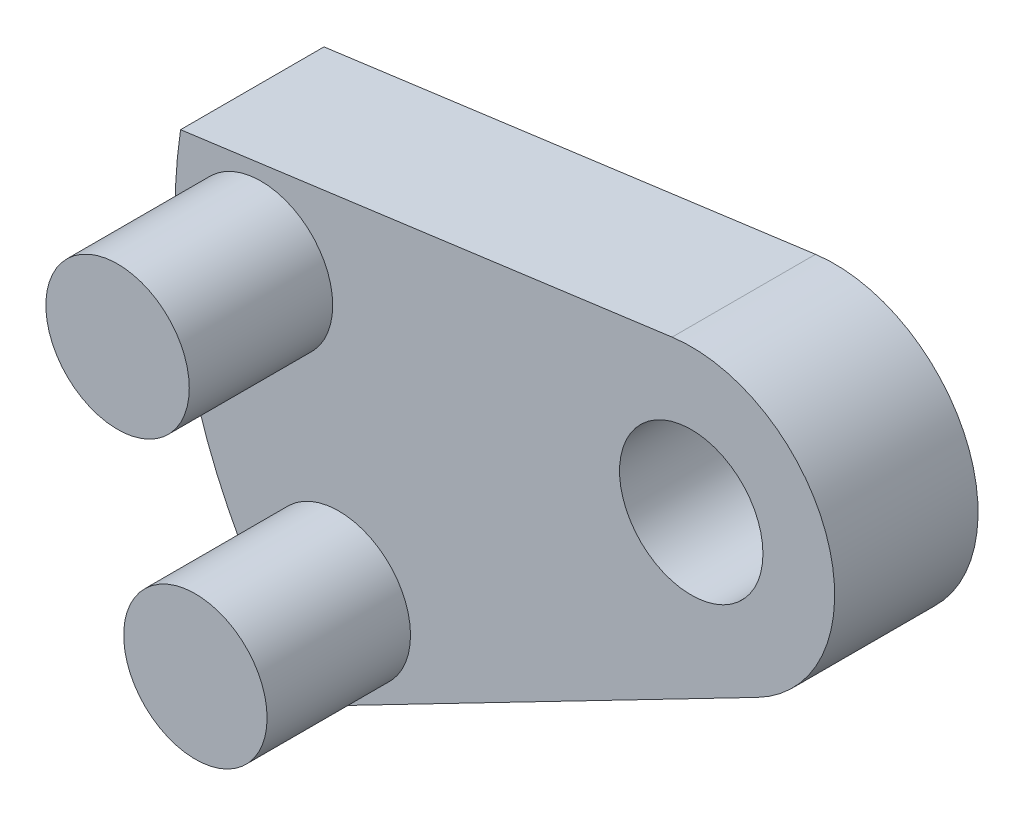
ISO-10303-21;
HEADER;
FILE_DESCRIPTION(('STEP AP214'),'2;1');
FILE_NAME('part.step','',(''),(''),'','','');
FILE_SCHEMA(('AUTOMOTIVE_DESIGN { 1 0 10303 214 1 1 1 1 }'));
ENDSEC;
DATA;
#1=APPLICATION_CONTEXT('core data for automotive mechanical design processes');
#2=APPLICATION_PROTOCOL_DEFINITION('international standard','automotive_design',2000,#1);
#3=PRODUCT_CONTEXT('',#1,'mechanical');
#4=PRODUCT('Part','Part','',(#3));
#5=PRODUCT_RELATED_PRODUCT_CATEGORY('part','',(#4));
#6=PRODUCT_DEFINITION_FORMATION('','',#4);
#7=PRODUCT_DEFINITION_CONTEXT('part definition',#1,'design');
#8=PRODUCT_DEFINITION('design','',#6,#7);
#9=PRODUCT_DEFINITION_SHAPE('','',#8);
#10=(LENGTH_UNIT() NAMED_UNIT(*) SI_UNIT(.MILLI.,.METRE.));
#11=(NAMED_UNIT(*) PLANE_ANGLE_UNIT() SI_UNIT($,.RADIAN.));
#12=(NAMED_UNIT(*) SI_UNIT($,.STERADIAN.) SOLID_ANGLE_UNIT());
#13=UNCERTAINTY_MEASURE_WITH_UNIT(LENGTH_MEASURE(1.E-05),#10,'distance_accuracy_value','');
#14=(GEOMETRIC_REPRESENTATION_CONTEXT(3) GLOBAL_UNCERTAINTY_ASSIGNED_CONTEXT((#13)) GLOBAL_UNIT_ASSIGNED_CONTEXT((#10,
#11,#12)) REPRESENTATION_CONTEXT('',''));
#15=CARTESIAN_POINT('',(0.,0.,0.));
#16=DIRECTION('',(0.,0.,1.));
#17=DIRECTION('',(1.,0.,0.));
#18=AXIS2_PLACEMENT_3D('',#15,#16,#17);
#19=CARTESIAN_POINT('',(0.,0.,-5.));
#20=DIRECTION('',(0.,0.,-1.));
#21=DIRECTION('',(0.,-1.,0.));
#22=AXIS2_PLACEMENT_3D('',#19,#20,#21);
#23=PLANE('',#22);
#24=CARTESIAN_POINT('',(0.,0.,-5.));
#25=DIRECTION('',(0.,0.,1.));
#26=DIRECTION('',(-1.,0.,0.));
#27=AXIS2_PLACEMENT_3D('',#24,#25,#26);
#28=CIRCLE('',#27,2.5);
#29=CARTESIAN_POINT('',(2.5,0.,-5.));
#30=VERTEX_POINT('',#29);
#31=EDGE_CURVE('E10',#30,#30,#28,.T.);
#32=ORIENTED_EDGE('',*,*,#31,.T.);
#33=EDGE_LOOP('',(#32));
#34=FACE_BOUND('',#33,.T.);
#35=DIRECTION('',(-0.888314898507249,-0.459234843070575,0.));
#36=VECTOR('',#35,1.);
#37=CARTESIAN_POINT('',(2.29617421535287,-4.44157449253624,-5.));
#38=LINE('',#37,#36);
#39=CARTESIAN_POINT('',(2.29617421535287,-4.44157449253624,-5.));
#40=VERTEX_POINT('',#39);
#41=CARTESIAN_POINT('',(-13.0642263104822,-12.3824872666402,-5.));
#42=VERTEX_POINT('',#41);
#43=EDGE_CURVE('E92',#40,#42,#38,.T.);
#44=ORIENTED_EDGE('',*,*,#43,.T.);
#45=CARTESIAN_POINT('',(0.,0.,-5.));
#46=DIRECTION('',(0.,0.,1.));
#47=DIRECTION('',(-1.,0.,0.));
#48=AXIS2_PLACEMENT_3D('',#45,#46,#47);
#49=CIRCLE('',#48,18.);
#50=CARTESIAN_POINT('',(-17.8038906088471,2.64980738700076,-5.));
#51=VERTEX_POINT('',#50);
#52=EDGE_CURVE('E140',#51,#42,#49,.T.);
#53=ORIENTED_EDGE('',*,*,#52,.F.);
#54=DIRECTION('',(0.991071249821234,0.133333333333333,0.));
#55=VECTOR('',#54,1.);
#56=CARTESIAN_POINT('',(-17.8038906088471,2.64980738700076,-5.));
#57=LINE('',#56,#55);
#58=CARTESIAN_POINT('',(-0.666666666666667,4.95535624910617,-5.));
#59=VERTEX_POINT('',#58);
#60=EDGE_CURVE('E94',#51,#59,#57,.T.);
#61=ORIENTED_EDGE('',*,*,#60,.T.);
#62=CARTESIAN_POINT('',(0.,0.,-5.));
#63=DIRECTION('',(0.,0.,-1.));
#64=DIRECTION('',(-0.459234843070575,0.888314898507249,0.));
#65=AXIS2_PLACEMENT_3D('',#62,#63,#64);
#66=CIRCLE('',#65,5.);
#67=EDGE_CURVE('E88',#59,#40,#66,.T.);
#68=ORIENTED_EDGE('',*,*,#67,.T.);
#69=EDGE_LOOP('',(#44,#53,#61,#68));
#70=FACE_BOUND('',#69,.T.);
#71=ADVANCED_FACE('F16',(#34,#70),#23,.T.);
#72=CARTESIAN_POINT('',(0.,0.,0.));
#73=DIRECTION('',(0.,0.,-1.));
#74=DIRECTION('',(-1.,0.,0.));
#75=AXIS2_PLACEMENT_3D('',#72,#73,#74);
#76=CYLINDRICAL_SURFACE('',#75,2.5);
#77=CARTESIAN_POINT('',(0.,0.,0.));
#78=DIRECTION('',(0.,0.,-1.));
#79=DIRECTION('',(-1.,0.,0.));
#80=AXIS2_PLACEMENT_3D('',#77,#78,#79);
#81=CIRCLE('',#80,2.5);
#82=CARTESIAN_POINT('',(2.5,0.,0.));
#83=VERTEX_POINT('',#82);
#84=EDGE_CURVE('E131',#83,#83,#81,.T.);
#85=ORIENTED_EDGE('',*,*,#84,.F.);
#86=EDGE_LOOP('',(#85));
#87=FACE_BOUND('',#86,.T.);
#88=ORIENTED_EDGE('',*,*,#31,.F.);
#89=EDGE_LOOP('',(#88));
#90=FACE_BOUND('',#89,.T.);
#91=ADVANCED_FACE('F207',(#87,#90),#76,.F.);
#92=CARTESIAN_POINT('',(-15.,0.,5.));
#93=DIRECTION('',(0.,0.,-1.));
#94=DIRECTION('',(0.,-1.,0.));
#95=AXIS2_PLACEMENT_3D('',#92,#93,#94);
#96=PLANE('',#95);
#97=CARTESIAN_POINT('',(-15.,0.,5.));
#98=DIRECTION('',(0.,0.,-1.));
#99=DIRECTION('',(-1.,0.,0.));
#100=AXIS2_PLACEMENT_3D('',#97,#98,#99);
#101=CIRCLE('',#100,2.5);
#102=CARTESIAN_POINT('',(-12.5,0.,5.));
#103=VERTEX_POINT('',#102);
#104=EDGE_CURVE('E27',#103,#103,#101,.T.);
#105=ORIENTED_EDGE('',*,*,#104,.F.);
#106=EDGE_LOOP('',(#105));
#107=FACE_BOUND('',#106,.T.);
#108=ADVANCED_FACE('F212',(#107),#96,.F.);
#109=CARTESIAN_POINT('',(-15.,0.,0.));
#110=DIRECTION('',(0.,0.,1.));
#111=DIRECTION('',(-1.,0.,0.));
#112=AXIS2_PLACEMENT_3D('',#109,#110,#111);
#113=CYLINDRICAL_SURFACE('',#112,2.5);
#114=CARTESIAN_POINT('',(-15.,0.,0.));
#115=DIRECTION('',(0.,0.,-1.));
#116=DIRECTION('',(-1.,0.,0.));
#117=AXIS2_PLACEMENT_3D('',#114,#115,#116);
#118=CIRCLE('',#117,2.5);
#119=CARTESIAN_POINT('',(-12.5,0.,0.));
#120=VERTEX_POINT('',#119);
#121=EDGE_CURVE('E128',#120,#120,#118,.T.);
#122=ORIENTED_EDGE('',*,*,#121,.F.);
#123=EDGE_LOOP('',(#122));
#124=FACE_BOUND('',#123,.T.);
#125=ORIENTED_EDGE('',*,*,#104,.T.);
#126=EDGE_LOOP('',(#125));
#127=FACE_BOUND('',#126,.T.);
#128=ADVANCED_FACE('F233',(#124,#127),#113,.T.);
#129=CARTESIAN_POINT('',(-12.2872806643349,-8.6036465452657,5.));
#130=DIRECTION('',(0.,0.,-1.));
#131=DIRECTION('',(0.,-1.,0.));
#132=AXIS2_PLACEMENT_3D('',#129,#130,#131);
#133=PLANE('',#132);
#134=CARTESIAN_POINT('',(-12.2872806643349,-8.6036465452657,5.));
#135=DIRECTION('',(0.,0.,-1.));
#136=DIRECTION('',(-1.,0.,0.));
#137=AXIS2_PLACEMENT_3D('',#134,#135,#136);
#138=CIRCLE('',#137,2.5);
#139=CARTESIAN_POINT('',(-9.78728066433487,-8.6036465452657,5.));
#140=VERTEX_POINT('',#139);
#141=EDGE_CURVE('E143',#140,#140,#138,.T.);
#142=ORIENTED_EDGE('',*,*,#141,.F.);
#143=EDGE_LOOP('',(#142));
#144=FACE_BOUND('',#143,.T.);
#145=ADVANCED_FACE('F18',(#144),#133,.F.);
#146=CARTESIAN_POINT('',(-12.2872806643349,-8.6036465452657,0.));
#147=DIRECTION('',(0.,0.,1.));
#148=DIRECTION('',(-1.,0.,0.));
#149=AXIS2_PLACEMENT_3D('',#146,#147,#148);
#150=CYLINDRICAL_SURFACE('',#149,2.5);
#151=CARTESIAN_POINT('',(-12.2872806643349,-8.6036465452657,0.));
#152=DIRECTION('',(0.,0.,-1.));
#153=DIRECTION('',(-1.,0.,0.));
#154=AXIS2_PLACEMENT_3D('',#151,#152,#153);
#155=CIRCLE('',#154,2.5);
#156=CARTESIAN_POINT('',(-9.78728066433487,-8.6036465452657,0.));
#157=VERTEX_POINT('',#156);
#158=EDGE_CURVE('E130',#157,#157,#155,.T.);
#159=ORIENTED_EDGE('',*,*,#158,.F.);
#160=EDGE_LOOP('',(#159));
#161=FACE_BOUND('',#160,.T.);
#162=ORIENTED_EDGE('',*,*,#141,.T.);
#163=EDGE_LOOP('',(#162));
#164=FACE_BOUND('',#163,.T.);
#165=ADVANCED_FACE('F180',(#161,#164),#150,.T.);
#166=CARTESIAN_POINT('',(0.,0.,0.));
#167=DIRECTION('',(0.,0.,-1.));
#168=DIRECTION('',(-1.,0.,0.));
#169=AXIS2_PLACEMENT_3D('',#166,#167,#168);
#170=CYLINDRICAL_SURFACE('',#169,18.);
#171=DIRECTION('',(0.,0.,1.));
#172=VECTOR('',#171,1.);
#173=CARTESIAN_POINT('',(-13.0642263104822,-12.3824872666402,-5.));
#174=LINE('',#173,#172);
#175=CARTESIAN_POINT('',(-13.0642263104822,-12.3824872666402,0.));
#176=VERTEX_POINT('',#175);
#177=EDGE_CURVE('E114',#42,#176,#174,.T.);
#178=ORIENTED_EDGE('',*,*,#177,.T.);
#179=CARTESIAN_POINT('',(0.,0.,0.));
#180=DIRECTION('',(0.,0.,-1.));
#181=DIRECTION('',(-1.,0.,0.));
#182=AXIS2_PLACEMENT_3D('',#179,#180,#181);
#183=CIRCLE('',#182,18.);
#184=CARTESIAN_POINT('',(-17.8038906088471,2.64980738700076,0.));
#185=VERTEX_POINT('',#184);
#186=EDGE_CURVE('E20',#176,#185,#183,.T.);
#187=ORIENTED_EDGE('',*,*,#186,.T.);
#188=DIRECTION('',(0.,0.,-1.));
#189=VECTOR('',#188,1.);
#190=CARTESIAN_POINT('',(-17.8038906088471,2.64980738700076,0.));
#191=LINE('',#190,#189);
#192=EDGE_CURVE('E125',#185,#51,#191,.T.);
#193=ORIENTED_EDGE('',*,*,#192,.T.);
#194=ORIENTED_EDGE('',*,*,#52,.T.);
#195=EDGE_LOOP('',(#178,#187,#193,#194));
#196=FACE_BOUND('',#195,.T.);
#197=ADVANCED_FACE('F186',(#196),#170,.T.);
#198=CARTESIAN_POINT('',(0.,0.,0.));
#199=DIRECTION('',(0.,0.,-1.));
#200=DIRECTION('',(0.,-1.,0.));
#201=AXIS2_PLACEMENT_3D('',#198,#199,#200);
#202=PLANE('',#201);
#203=ORIENTED_EDGE('',*,*,#158,.T.);
#204=EDGE_LOOP('',(#203));
#205=FACE_BOUND('',#204,.T.);
#206=ORIENTED_EDGE('',*,*,#121,.T.);
#207=EDGE_LOOP('',(#206));
#208=FACE_BOUND('',#207,.T.);
#209=ORIENTED_EDGE('',*,*,#84,.T.);
#210=EDGE_LOOP('',(#209));
#211=FACE_BOUND('',#210,.T.);
#212=DIRECTION('',(0.888314898507249,0.459234843070575,0.));
#213=VECTOR('',#212,1.);
#214=CARTESIAN_POINT('',(-13.0642263104822,-12.3824872666402,0.));
#215=LINE('',#214,#213);
#216=CARTESIAN_POINT('',(2.29617421535287,-4.44157449253624,0.));
#217=VERTEX_POINT('',#216);
#218=EDGE_CURVE('E109',#176,#217,#215,.T.);
#219=ORIENTED_EDGE('',*,*,#218,.T.);
#220=CARTESIAN_POINT('',(0.,0.,0.));
#221=DIRECTION('',(0.,0.,1.));
#222=DIRECTION('',(-0.459234843070575,0.888314898507249,0.));
#223=AXIS2_PLACEMENT_3D('',#220,#221,#222);
#224=CIRCLE('',#223,5.);
#225=CARTESIAN_POINT('',(-0.666666666666667,4.95535624910617,0.));
#226=VERTEX_POINT('',#225);
#227=EDGE_CURVE('E99',#217,#226,#224,.T.);
#228=ORIENTED_EDGE('',*,*,#227,.T.);
#229=DIRECTION('',(-0.991071249821234,-0.133333333333333,0.));
#230=VECTOR('',#229,1.);
#231=CARTESIAN_POINT('',(-0.666666666666667,4.95535624910617,0.));
#232=LINE('',#231,#230);
#233=EDGE_CURVE('E136',#226,#185,#232,.T.);
#234=ORIENTED_EDGE('',*,*,#233,.T.);
#235=ORIENTED_EDGE('',*,*,#186,.F.);
#236=EDGE_LOOP('',(#219,#228,#234,#235));
#237=FACE_BOUND('',#236,.T.);
#238=ADVANCED_FACE('F157',(#205,#208,#211,#237),#202,.F.);
#239=CARTESIAN_POINT('',(0.,0.,0.));
#240=DIRECTION('',(0.,0.,-1.));
#241=DIRECTION('',(-0.459234843070575,0.888314898507249,0.));
#242=AXIS2_PLACEMENT_3D('',#239,#240,#241);
#243=CYLINDRICAL_SURFACE('',#242,5.);
#244=ORIENTED_EDGE('',*,*,#67,.F.);
#245=DIRECTION('',(0.,0.,-1.));
#246=VECTOR('',#245,1.);
#247=CARTESIAN_POINT('',(-0.666666666666667,4.95535624910617,0.));
#248=LINE('',#247,#246);
#249=EDGE_CURVE('E100',#226,#59,#248,.T.);
#250=ORIENTED_EDGE('',*,*,#249,.F.);
#251=ORIENTED_EDGE('',*,*,#227,.F.);
#252=DIRECTION('',(0.,0.,-1.));
#253=VECTOR('',#252,1.);
#254=CARTESIAN_POINT('',(2.29617421535287,-4.44157449253624,0.));
#255=LINE('',#254,#253);
#256=EDGE_CURVE('E103',#217,#40,#255,.T.);
#257=ORIENTED_EDGE('',*,*,#256,.T.);
#258=EDGE_LOOP('',(#244,#250,#251,#257));
#259=FACE_BOUND('',#258,.T.);
#260=ADVANCED_FACE('F104',(#259),#243,.T.);
#261=CARTESIAN_POINT('',(-17.8038906088471,2.64980738700076,0.));
#262=DIRECTION('',(0.133333333333333,-0.991071249821234,0.));
#263=DIRECTION('',(0.,0.,-1.));
#264=AXIS2_PLACEMENT_3D('',#261,#262,#263);
#265=PLANE('',#264);
#266=ORIENTED_EDGE('',*,*,#60,.F.);
#267=ORIENTED_EDGE('',*,*,#192,.F.);
#268=ORIENTED_EDGE('',*,*,#233,.F.);
#269=ORIENTED_EDGE('',*,*,#249,.T.);
#270=EDGE_LOOP('',(#266,#267,#268,#269));
#271=FACE_BOUND('',#270,.T.);
#272=ADVANCED_FACE('F154',(#271),#265,.F.);
#273=CARTESIAN_POINT('',(2.29617421535287,-4.44157449253624,0.));
#274=DIRECTION('',(-0.459234843070575,0.888314898507249,0.));
#275=DIRECTION('',(0.,0.,1.));
#276=AXIS2_PLACEMENT_3D('',#273,#274,#275);
#277=PLANE('',#276);
#278=ORIENTED_EDGE('',*,*,#43,.F.);
#279=ORIENTED_EDGE('',*,*,#256,.F.);
#280=ORIENTED_EDGE('',*,*,#218,.F.);
#281=ORIENTED_EDGE('',*,*,#177,.F.);
#282=EDGE_LOOP('',(#278,#279,#280,#281));
#283=FACE_BOUND('',#282,.T.);
#284=ADVANCED_FACE('F112',(#283),#277,.F.);
#285=CLOSED_SHELL('',(#71,#91,#108,#128,#145,#165,#197,#238,#260,#272,#284));
#286=MANIFOLD_SOLID_BREP('B1',#285);
#287=ADVANCED_BREP_SHAPE_REPRESENTATION('',(#18,#286),#14);
#288=SHAPE_DEFINITION_REPRESENTATION(#9,#287);
ENDSEC;
END-ISO-10303-21;
